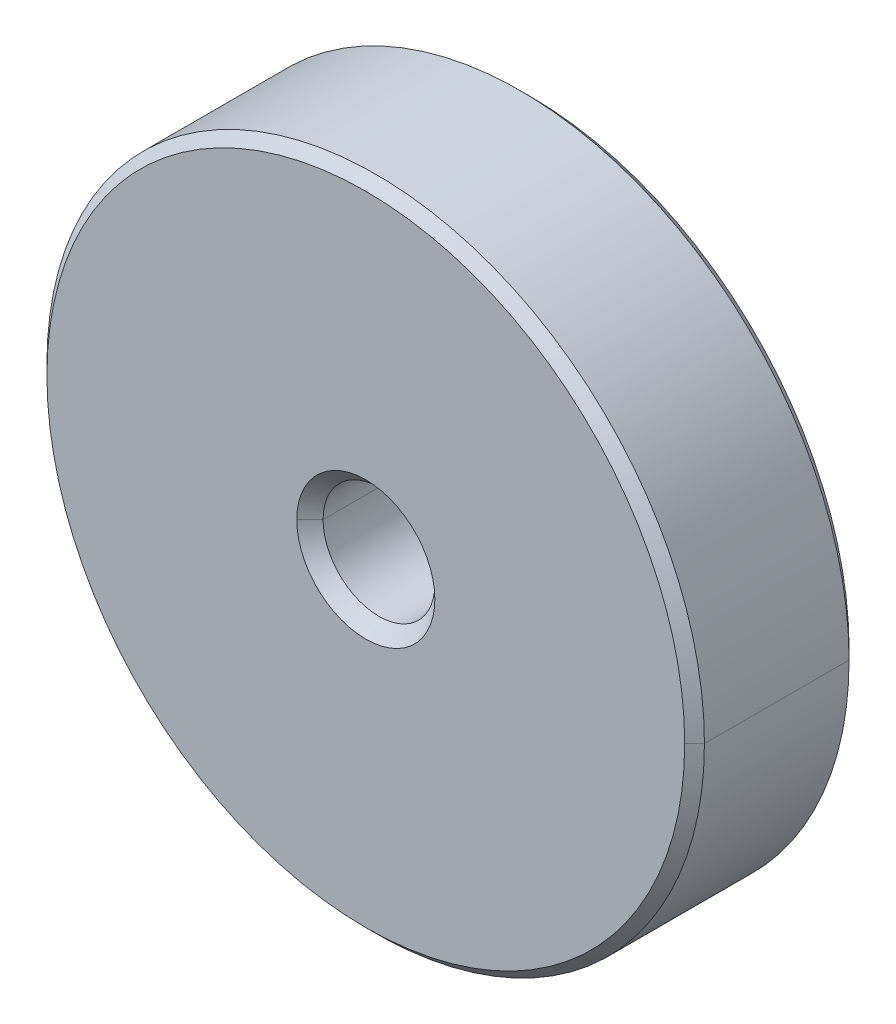
ISO-10303-21;
HEADER;
FILE_DESCRIPTION(('STEP AP214'),'2;1');
FILE_NAME('part.step','',(''),(''),'','','');
FILE_SCHEMA(('AUTOMOTIVE_DESIGN { 1 0 10303 214 1 1 1 1 }'));
ENDSEC;
DATA;
#1=APPLICATION_CONTEXT('core data for automotive mechanical design processes');
#2=APPLICATION_PROTOCOL_DEFINITION('international standard','automotive_design',2000,#1);
#3=PRODUCT_CONTEXT('',#1,'mechanical');
#4=PRODUCT('Part','Part','',(#3));
#5=PRODUCT_RELATED_PRODUCT_CATEGORY('part','',(#4));
#6=PRODUCT_DEFINITION_FORMATION('','',#4);
#7=PRODUCT_DEFINITION_CONTEXT('part definition',#1,'design');
#8=PRODUCT_DEFINITION('design','',#6,#7);
#9=PRODUCT_DEFINITION_SHAPE('','',#8);
#10=(LENGTH_UNIT() NAMED_UNIT(*) SI_UNIT(.MILLI.,.METRE.));
#11=(NAMED_UNIT(*) PLANE_ANGLE_UNIT() SI_UNIT($,.RADIAN.));
#12=(NAMED_UNIT(*) SI_UNIT($,.STERADIAN.) SOLID_ANGLE_UNIT());
#13=UNCERTAINTY_MEASURE_WITH_UNIT(LENGTH_MEASURE(1.E-05),#10,'distance_accuracy_value','');
#14=(GEOMETRIC_REPRESENTATION_CONTEXT(3) GLOBAL_UNCERTAINTY_ASSIGNED_CONTEXT((#13)) GLOBAL_UNIT_ASSIGNED_CONTEXT((#10,
#11,#12)) REPRESENTATION_CONTEXT('',''));
#15=CARTESIAN_POINT('',(0.,0.,0.));
#16=DIRECTION('',(0.,0.,1.));
#17=DIRECTION('',(1.,0.,0.));
#18=AXIS2_PLACEMENT_3D('',#15,#16,#17);
#19=CARTESIAN_POINT('',(0.,0.,0.));
#20=DIRECTION('',(0.,0.,1.));
#21=DIRECTION('',(1.,0.,0.));
#22=AXIS2_PLACEMENT_3D('',#19,#20,#21);
#23=PLANE('',#22);
#24=CARTESIAN_POINT('',(0.,0.,0.));
#25=DIRECTION('',(0.,0.,1.));
#26=DIRECTION('',(1.,0.,0.));
#27=AXIS2_PLACEMENT_3D('',#24,#25,#26);
#28=CIRCLE('',#27,2.667);
#29=CARTESIAN_POINT('',(2.667,0.,0.));
#30=VERTEX_POINT('',#29);
#31=CARTESIAN_POINT('',(-2.667,0.,0.));
#32=VERTEX_POINT('',#31);
#33=EDGE_CURVE('E20',#30,#32,#28,.T.);
#34=ORIENTED_EDGE('',*,*,#33,.T.);
#35=CARTESIAN_POINT('',(0.,0.,0.));
#36=DIRECTION('',(0.,0.,1.));
#37=DIRECTION('',(-1.,0.,0.));
#38=AXIS2_PLACEMENT_3D('',#35,#36,#37);
#39=CIRCLE('',#38,2.667);
#40=EDGE_CURVE('E123',#32,#30,#39,.T.);
#41=ORIENTED_EDGE('',*,*,#40,.T.);
#42=EDGE_LOOP('',(#34,#41));
#43=FACE_BOUND('',#42,.T.);
#44=CARTESIAN_POINT('',(0.,0.,0.));
#45=DIRECTION('',(0.,0.,-1.));
#46=DIRECTION('',(-1.,0.,0.));
#47=AXIS2_PLACEMENT_3D('',#44,#45,#46);
#48=CIRCLE('',#47,12.319);
#49=CARTESIAN_POINT('',(-12.319,0.,0.));
#50=VERTEX_POINT('',#49);
#51=CARTESIAN_POINT('',(12.319,0.,0.));
#52=VERTEX_POINT('',#51);
#53=EDGE_CURVE('E11',#50,#52,#48,.T.);
#54=ORIENTED_EDGE('',*,*,#53,.T.);
#55=CARTESIAN_POINT('',(0.,0.,0.));
#56=DIRECTION('',(0.,0.,-1.));
#57=DIRECTION('',(1.,0.,0.));
#58=AXIS2_PLACEMENT_3D('',#55,#56,#57);
#59=CIRCLE('',#58,12.319);
#60=EDGE_CURVE('E26',#52,#50,#59,.T.);
#61=ORIENTED_EDGE('',*,*,#60,.T.);
#62=EDGE_LOOP('',(#54,#61));
#63=FACE_BOUND('',#62,.T.);
#64=ADVANCED_FACE('F17',(#43,#63),#23,.F.);
#65=CARTESIAN_POINT('',(0.,0.,-0.0309525863216725));
#66=DIRECTION('',(0.,0.,1.));
#67=DIRECTION('',(1.,0.,0.));
#68=AXIS2_PLACEMENT_3D('',#65,#66,#67);
#69=CONICAL_SURFACE('',#68,12.2880474136783,0.785398163397448);
#70=DIRECTION('',(0.707106781186547,0.,-0.707106781186547));
#71=VECTOR('',#70,1.);
#72=CARTESIAN_POINT('',(-12.7,0.,0.381000000000001));
#73=LINE('',#72,#71);
#74=CARTESIAN_POINT('',(-12.7,0.,0.381000000000002));
#75=VERTEX_POINT('',#74);
#76=EDGE_CURVE('E81',#75,#50,#73,.T.);
#77=ORIENTED_EDGE('',*,*,#76,.F.);
#78=CARTESIAN_POINT('',(0.,0.,0.380999999999996));
#79=DIRECTION('',(0.,0.,-1.));
#80=DIRECTION('',(-1.,0.,0.));
#81=AXIS2_PLACEMENT_3D('',#78,#79,#80);
#82=CIRCLE('',#81,12.7);
#83=CARTESIAN_POINT('',(12.7,0.,0.381000000000002));
#84=VERTEX_POINT('',#83);
#85=EDGE_CURVE('E86',#75,#84,#82,.T.);
#86=ORIENTED_EDGE('',*,*,#85,.T.);
#87=DIRECTION('',(-0.707106781186547,0.,-0.707106781186547));
#88=VECTOR('',#87,1.);
#89=CARTESIAN_POINT('',(12.7,0.,0.381000000000001));
#90=LINE('',#89,#88);
#91=EDGE_CURVE('E91',#84,#52,#90,.T.);
#92=ORIENTED_EDGE('',*,*,#91,.T.);
#93=ORIENTED_EDGE('',*,*,#53,.F.);
#94=EDGE_LOOP('',(#77,#86,#92,#93));
#95=FACE_BOUND('',#94,.T.);
#96=ADVANCED_FACE('F83',(#95),#69,.T.);
#97=CARTESIAN_POINT('',(0.,0.,-0.0309525863216725));
#98=DIRECTION('',(0.,0.,1.));
#99=DIRECTION('',(1.,0.,0.));
#100=AXIS2_PLACEMENT_3D('',#97,#98,#99);
#101=CONICAL_SURFACE('',#100,12.2880474136783,0.785398163397448);
#102=ORIENTED_EDGE('',*,*,#60,.F.);
#103=ORIENTED_EDGE('',*,*,#91,.F.);
#104=CARTESIAN_POINT('',(0.,0.,0.380999999999996));
#105=DIRECTION('',(0.,0.,-1.));
#106=DIRECTION('',(1.,0.,0.));
#107=AXIS2_PLACEMENT_3D('',#104,#105,#106);
#108=CIRCLE('',#107,12.7);
#109=EDGE_CURVE('E92',#84,#75,#108,.T.);
#110=ORIENTED_EDGE('',*,*,#109,.T.);
#111=ORIENTED_EDGE('',*,*,#76,.T.);
#112=EDGE_LOOP('',(#102,#103,#110,#111));
#113=FACE_BOUND('',#112,.T.);
#114=ADVANCED_FACE('F96',(#113),#101,.T.);
#115=CARTESIAN_POINT('',(0.,0.,6.35));
#116=DIRECTION('',(0.,0.,-1.));
#117=DIRECTION('',(-1.,0.,0.));
#118=AXIS2_PLACEMENT_3D('',#115,#116,#117);
#119=CYLINDRICAL_SURFACE('',#118,12.7);
#120=CARTESIAN_POINT('',(0.,0.,5.969));
#121=DIRECTION('',(0.,0.,1.));
#122=DIRECTION('',(-1.,0.,0.));
#123=AXIS2_PLACEMENT_3D('',#120,#121,#122);
#124=CIRCLE('',#123,12.7);
#125=CARTESIAN_POINT('',(-12.7,0.,5.969));
#126=VERTEX_POINT('',#125);
#127=CARTESIAN_POINT('',(12.7,0.,5.969));
#128=VERTEX_POINT('',#127);
#129=EDGE_CURVE('E106',#126,#128,#124,.T.);
#130=ORIENTED_EDGE('',*,*,#129,.F.);
#131=DIRECTION('',(0.,0.,1.));
#132=VECTOR('',#131,1.);
#133=CARTESIAN_POINT('',(-12.7,0.,0.381000000000003));
#134=LINE('',#133,#132);
#135=EDGE_CURVE('E103',#75,#126,#134,.T.);
#136=ORIENTED_EDGE('',*,*,#135,.F.);
#137=ORIENTED_EDGE('',*,*,#109,.F.);
#138=DIRECTION('',(0.,0.,1.));
#139=VECTOR('',#138,1.);
#140=CARTESIAN_POINT('',(12.7,0.,0.381000000000003));
#141=LINE('',#140,#139);
#142=EDGE_CURVE('E100',#84,#128,#141,.T.);
#143=ORIENTED_EDGE('',*,*,#142,.T.);
#144=EDGE_LOOP('',(#130,#136,#137,#143));
#145=FACE_BOUND('',#144,.T.);
#146=ADVANCED_FACE('F104',(#145),#119,.T.);
#147=CARTESIAN_POINT('',(0.,0.,6.35));
#148=DIRECTION('',(0.,0.,-1.));
#149=DIRECTION('',(-1.,0.,0.));
#150=AXIS2_PLACEMENT_3D('',#147,#148,#149);
#151=CYLINDRICAL_SURFACE('',#150,12.7);
#152=ORIENTED_EDGE('',*,*,#142,.F.);
#153=ORIENTED_EDGE('',*,*,#85,.F.);
#154=ORIENTED_EDGE('',*,*,#135,.T.);
#155=CARTESIAN_POINT('',(0.,0.,5.969));
#156=DIRECTION('',(0.,0.,1.));
#157=DIRECTION('',(1.,0.,0.));
#158=AXIS2_PLACEMENT_3D('',#155,#156,#157);
#159=CIRCLE('',#158,12.7);
#160=EDGE_CURVE('E111',#128,#126,#159,.T.);
#161=ORIENTED_EDGE('',*,*,#160,.F.);
#162=EDGE_LOOP('',(#152,#153,#154,#161));
#163=FACE_BOUND('',#162,.T.);
#164=ADVANCED_FACE('F113',(#163),#151,.T.);
#165=CARTESIAN_POINT('',(0.,0.,6.38095258632165));
#166=DIRECTION('',(0.,0.,-1.));
#167=DIRECTION('',(-1.,0.,0.));
#168=AXIS2_PLACEMENT_3D('',#165,#166,#167);
#169=CONICAL_SURFACE('',#168,12.2880474136783,0.785398163397443);
#170=DIRECTION('',(-0.707106781186544,0.,0.707106781186551));
#171=VECTOR('',#170,1.);
#172=CARTESIAN_POINT('',(12.7,0.,5.969));
#173=LINE('',#172,#171);
#174=CARTESIAN_POINT('',(12.319,0.,6.34999999999999));
#175=VERTEX_POINT('',#174);
#176=EDGE_CURVE('E176',#128,#175,#173,.T.);
#177=ORIENTED_EDGE('',*,*,#176,.F.);
#178=ORIENTED_EDGE('',*,*,#160,.T.);
#179=DIRECTION('',(0.707106781186544,0.,0.707106781186551));
#180=VECTOR('',#179,1.);
#181=CARTESIAN_POINT('',(-12.7,0.,5.969));
#182=LINE('',#181,#180);
#183=CARTESIAN_POINT('',(-12.319,0.,6.34999999999999));
#184=VERTEX_POINT('',#183);
#185=EDGE_CURVE('E186',#126,#184,#182,.T.);
#186=ORIENTED_EDGE('',*,*,#185,.T.);
#187=CARTESIAN_POINT('',(0.,0.,6.34999999999998));
#188=DIRECTION('',(0.,0.,1.));
#189=DIRECTION('',(1.,0.,0.));
#190=AXIS2_PLACEMENT_3D('',#187,#188,#189);
#191=CIRCLE('',#190,12.319);
#192=EDGE_CURVE('E172',#175,#184,#191,.T.);
#193=ORIENTED_EDGE('',*,*,#192,.F.);
#194=EDGE_LOOP('',(#177,#178,#186,#193));
#195=FACE_BOUND('',#194,.T.);
#196=ADVANCED_FACE('F194',(#195),#169,.T.);
#197=CARTESIAN_POINT('',(0.,0.,6.38095258632165));
#198=DIRECTION('',(0.,0.,-1.));
#199=DIRECTION('',(-1.,0.,0.));
#200=AXIS2_PLACEMENT_3D('',#197,#198,#199);
#201=CONICAL_SURFACE('',#200,12.2880474136783,0.785398163397443);
#202=CARTESIAN_POINT('',(0.,0.,6.34999999999998));
#203=DIRECTION('',(0.,0.,1.));
#204=DIRECTION('',(-1.,0.,0.));
#205=AXIS2_PLACEMENT_3D('',#202,#203,#204);
#206=CIRCLE('',#205,12.319);
#207=EDGE_CURVE('E168',#184,#175,#206,.T.);
#208=ORIENTED_EDGE('',*,*,#207,.F.);
#209=ORIENTED_EDGE('',*,*,#185,.F.);
#210=ORIENTED_EDGE('',*,*,#129,.T.);
#211=ORIENTED_EDGE('',*,*,#176,.T.);
#212=EDGE_LOOP('',(#208,#209,#210,#211));
#213=FACE_BOUND('',#212,.T.);
#214=ADVANCED_FACE('F197',(#213),#201,.T.);
#215=CARTESIAN_POINT('',(0.,0.,6.35));
#216=DIRECTION('',(0.,0.,1.));
#217=DIRECTION('',(1.,0.,0.));
#218=AXIS2_PLACEMENT_3D('',#215,#216,#217);
#219=PLANE('',#218);
#220=CARTESIAN_POINT('',(0.,0.,6.35));
#221=DIRECTION('',(0.,0.,-1.));
#222=DIRECTION('',(1.,0.,0.));
#223=AXIS2_PLACEMENT_3D('',#220,#221,#222);
#224=CIRCLE('',#223,2.667);
#225=CARTESIAN_POINT('',(2.667,0.,6.35));
#226=VERTEX_POINT('',#225);
#227=CARTESIAN_POINT('',(-2.667,0.,6.35));
#228=VERTEX_POINT('',#227);
#229=EDGE_CURVE('E36',#226,#228,#224,.T.);
#230=ORIENTED_EDGE('',*,*,#229,.T.);
#231=CARTESIAN_POINT('',(0.,0.,6.35));
#232=DIRECTION('',(0.,0.,-1.));
#233=DIRECTION('',(-1.,0.,0.));
#234=AXIS2_PLACEMENT_3D('',#231,#232,#233);
#235=CIRCLE('',#234,2.667);
#236=EDGE_CURVE('E33',#228,#226,#235,.T.);
#237=ORIENTED_EDGE('',*,*,#236,.T.);
#238=EDGE_LOOP('',(#230,#237));
#239=FACE_BOUND('',#238,.T.);
#240=ORIENTED_EDGE('',*,*,#192,.T.);
#241=ORIENTED_EDGE('',*,*,#207,.T.);
#242=EDGE_LOOP('',(#240,#241));
#243=FACE_BOUND('',#242,.T.);
#244=ADVANCED_FACE('F199',(#239,#243),#219,.T.);
#245=CARTESIAN_POINT('',(0.,0.,5.81104741367834));
#246=DIRECTION('',(0.,0.,1.));
#247=DIRECTION('',(1.,0.,0.));
#248=AXIS2_PLACEMENT_3D('',#245,#246,#247);
#249=CONICAL_SURFACE('',#248,2.12804741367834,0.785398163397448);
#250=DIRECTION('',(0.707106781186547,0.,-0.707106781186548));
#251=VECTOR('',#250,1.);
#252=CARTESIAN_POINT('',(-2.667,0.,6.35));
#253=LINE('',#252,#251);
#254=CARTESIAN_POINT('',(-2.159,0.,5.842));
#255=VERTEX_POINT('',#254);
#256=EDGE_CURVE('E156',#228,#255,#253,.T.);
#257=ORIENTED_EDGE('',*,*,#256,.F.);
#258=ORIENTED_EDGE('',*,*,#229,.F.);
#259=DIRECTION('',(-0.707106781186547,0.,-0.707106781186548));
#260=VECTOR('',#259,1.);
#261=CARTESIAN_POINT('',(2.667,0.,6.35));
#262=LINE('',#261,#260);
#263=CARTESIAN_POINT('',(2.159,0.,5.842));
#264=VERTEX_POINT('',#263);
#265=EDGE_CURVE('E165',#226,#264,#262,.T.);
#266=ORIENTED_EDGE('',*,*,#265,.T.);
#267=CARTESIAN_POINT('',(0.,0.,5.842));
#268=DIRECTION('',(0.,0.,-1.));
#269=DIRECTION('',(1.,0.,0.));
#270=AXIS2_PLACEMENT_3D('',#267,#268,#269);
#271=CIRCLE('',#270,2.159);
#272=EDGE_CURVE('E134',#264,#255,#271,.T.);
#273=ORIENTED_EDGE('',*,*,#272,.T.);
#274=EDGE_LOOP('',(#257,#258,#266,#273));
#275=FACE_BOUND('',#274,.T.);
#276=ADVANCED_FACE('F201',(#275),#249,.F.);
#277=CARTESIAN_POINT('',(0.,0.,5.81104741367834));
#278=DIRECTION('',(0.,0.,1.));
#279=DIRECTION('',(1.,0.,0.));
#280=AXIS2_PLACEMENT_3D('',#277,#278,#279);
#281=CONICAL_SURFACE('',#280,2.12804741367834,0.785398163397448);
#282=CARTESIAN_POINT('',(0.,0.,5.842));
#283=DIRECTION('',(0.,0.,-1.));
#284=DIRECTION('',(-1.,0.,0.));
#285=AXIS2_PLACEMENT_3D('',#282,#283,#284);
#286=CIRCLE('',#285,2.159);
#287=EDGE_CURVE('E155',#255,#264,#286,.T.);
#288=ORIENTED_EDGE('',*,*,#287,.T.);
#289=ORIENTED_EDGE('',*,*,#265,.F.);
#290=ORIENTED_EDGE('',*,*,#236,.F.);
#291=ORIENTED_EDGE('',*,*,#256,.T.);
#292=EDGE_LOOP('',(#288,#289,#290,#291));
#293=FACE_BOUND('',#292,.T.);
#294=ADVANCED_FACE('F208',(#293),#281,.F.);
#295=CARTESIAN_POINT('',(0.,0.,6.35));
#296=DIRECTION('',(0.,0.,1.));
#297=DIRECTION('',(1.,0.,0.));
#298=AXIS2_PLACEMENT_3D('',#295,#296,#297);
#299=CYLINDRICAL_SURFACE('',#298,2.159);
#300=CARTESIAN_POINT('',(0.,0.,0.508000000000002));
#301=DIRECTION('',(0.,0.,1.));
#302=DIRECTION('',(1.,0.,0.));
#303=AXIS2_PLACEMENT_3D('',#300,#301,#302);
#304=CIRCLE('',#303,2.159);
#305=CARTESIAN_POINT('',(2.159,0.,0.507999999999998));
#306=VERTEX_POINT('',#305);
#307=CARTESIAN_POINT('',(-2.159,0.,0.507999999999998));
#308=VERTEX_POINT('',#307);
#309=EDGE_CURVE('E137',#306,#308,#304,.T.);
#310=ORIENTED_EDGE('',*,*,#309,.F.);
#311=DIRECTION('',(0.,0.,-1.));
#312=VECTOR('',#311,1.);
#313=CARTESIAN_POINT('',(2.159,0.,5.842));
#314=LINE('',#313,#312);
#315=EDGE_CURVE('E125',#264,#306,#314,.T.);
#316=ORIENTED_EDGE('',*,*,#315,.F.);
#317=ORIENTED_EDGE('',*,*,#287,.F.);
#318=DIRECTION('',(0.,0.,-1.));
#319=VECTOR('',#318,1.);
#320=CARTESIAN_POINT('',(-2.159,0.,5.842));
#321=LINE('',#320,#319);
#322=EDGE_CURVE('E152',#255,#308,#321,.T.);
#323=ORIENTED_EDGE('',*,*,#322,.T.);
#324=EDGE_LOOP('',(#310,#316,#317,#323));
#325=FACE_BOUND('',#324,.T.);
#326=ADVANCED_FACE('F234',(#325),#299,.F.);
#327=CARTESIAN_POINT('',(0.,0.,6.35));
#328=DIRECTION('',(0.,0.,1.));
#329=DIRECTION('',(1.,0.,0.));
#330=AXIS2_PLACEMENT_3D('',#327,#328,#329);
#331=CYLINDRICAL_SURFACE('',#330,2.159);
#332=ORIENTED_EDGE('',*,*,#322,.F.);
#333=ORIENTED_EDGE('',*,*,#272,.F.);
#334=ORIENTED_EDGE('',*,*,#315,.T.);
#335=CARTESIAN_POINT('',(0.,0.,0.508000000000002));
#336=DIRECTION('',(0.,0.,1.));
#337=DIRECTION('',(-1.,0.,0.));
#338=AXIS2_PLACEMENT_3D('',#335,#336,#337);
#339=CIRCLE('',#338,2.159);
#340=EDGE_CURVE('E126',#308,#306,#339,.T.);
#341=ORIENTED_EDGE('',*,*,#340,.F.);
#342=EDGE_LOOP('',(#332,#333,#334,#341));
#343=FACE_BOUND('',#342,.T.);
#344=ADVANCED_FACE('F239',(#343),#331,.F.);
#345=CARTESIAN_POINT('',(0.,0.,0.538952586321664));
#346=DIRECTION('',(0.,0.,-1.));
#347=DIRECTION('',(-1.,0.,0.));
#348=AXIS2_PLACEMENT_3D('',#345,#346,#347);
#349=CONICAL_SURFACE('',#348,2.12804741367834,0.785398163397448);
#350=DIRECTION('',(-0.707106781186547,0.,0.707106781186548));
#351=VECTOR('',#350,1.);
#352=CARTESIAN_POINT('',(2.667,0.,0.));
#353=LINE('',#352,#351);
#354=EDGE_CURVE('E229',#30,#306,#353,.T.);
#355=ORIENTED_EDGE('',*,*,#354,.F.);
#356=ORIENTED_EDGE('',*,*,#40,.F.);
#357=DIRECTION('',(0.707106781186547,0.,0.707106781186548));
#358=VECTOR('',#357,1.);
#359=CARTESIAN_POINT('',(-2.667,0.,0.));
#360=LINE('',#359,#358);
#361=EDGE_CURVE('E146',#32,#308,#360,.T.);
#362=ORIENTED_EDGE('',*,*,#361,.T.);
#363=ORIENTED_EDGE('',*,*,#340,.T.);
#364=EDGE_LOOP('',(#355,#356,#362,#363));
#365=FACE_BOUND('',#364,.T.);
#366=ADVANCED_FACE('F230',(#365),#349,.F.);
#367=CARTESIAN_POINT('',(0.,0.,0.538952586321664));
#368=DIRECTION('',(0.,0.,-1.));
#369=DIRECTION('',(-1.,0.,0.));
#370=AXIS2_PLACEMENT_3D('',#367,#368,#369);
#371=CONICAL_SURFACE('',#370,2.12804741367834,0.785398163397448);
#372=ORIENTED_EDGE('',*,*,#309,.T.);
#373=ORIENTED_EDGE('',*,*,#361,.F.);
#374=ORIENTED_EDGE('',*,*,#33,.F.);
#375=ORIENTED_EDGE('',*,*,#354,.T.);
#376=EDGE_LOOP('',(#372,#373,#374,#375));
#377=FACE_BOUND('',#376,.T.);
#378=ADVANCED_FACE('F231',(#377),#371,.F.);
#379=CLOSED_SHELL('',(#64,#96,#114,#146,#164,#196,#214,#244,#276,#294,#326,#344,#366,#378));
#380=MANIFOLD_SOLID_BREP('B1',#379);
#381=ADVANCED_BREP_SHAPE_REPRESENTATION('',(#18,#380),#14);
#382=SHAPE_DEFINITION_REPRESENTATION(#9,#381);
ENDSEC;
END-ISO-10303-21;
